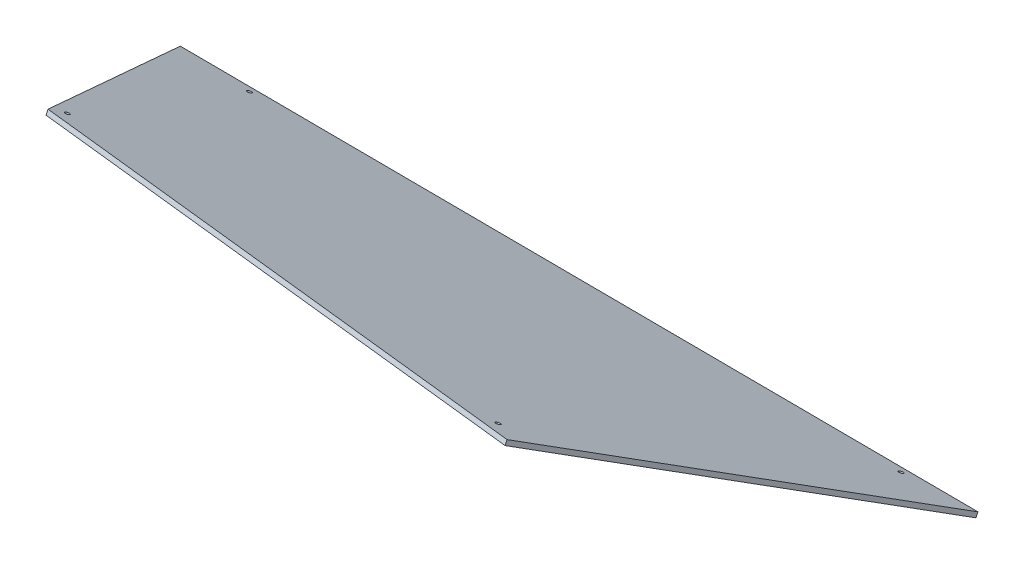
ISO-10303-21;
HEADER;
FILE_DESCRIPTION(('STEP AP214'),'2;1');
FILE_NAME('part.step','',(''),(''),'','','');
FILE_SCHEMA(('AUTOMOTIVE_DESIGN { 1 0 10303 214 1 1 1 1 }'));
ENDSEC;
DATA;
#1=APPLICATION_CONTEXT('core data for automotive mechanical design processes');
#2=APPLICATION_PROTOCOL_DEFINITION('international standard','automotive_design',2000,#1);
#3=PRODUCT_CONTEXT('',#1,'mechanical');
#4=PRODUCT('Part','Part','',(#3));
#5=PRODUCT_RELATED_PRODUCT_CATEGORY('part','',(#4));
#6=PRODUCT_DEFINITION_FORMATION('','',#4);
#7=PRODUCT_DEFINITION_CONTEXT('part definition',#1,'design');
#8=PRODUCT_DEFINITION('design','',#6,#7);
#9=PRODUCT_DEFINITION_SHAPE('','',#8);
#10=(LENGTH_UNIT() NAMED_UNIT(*) SI_UNIT(.MILLI.,.METRE.));
#11=(NAMED_UNIT(*) PLANE_ANGLE_UNIT() SI_UNIT($,.RADIAN.));
#12=(NAMED_UNIT(*) SI_UNIT($,.STERADIAN.) SOLID_ANGLE_UNIT());
#13=UNCERTAINTY_MEASURE_WITH_UNIT(LENGTH_MEASURE(1.E-05),#10,'distance_accuracy_value','');
#14=(GEOMETRIC_REPRESENTATION_CONTEXT(3) GLOBAL_UNCERTAINTY_ASSIGNED_CONTEXT((#13)) GLOBAL_UNIT_ASSIGNED_CONTEXT((#10,
#11,#12)) REPRESENTATION_CONTEXT('',''));
#15=CARTESIAN_POINT('',(0.,0.,0.));
#16=DIRECTION('',(0.,0.,1.));
#17=DIRECTION('',(1.,0.,0.));
#18=AXIS2_PLACEMENT_3D('',#15,#16,#17);
#19=CARTESIAN_POINT('',(-0.00358139259848318,-432.219760344882,1619.03143783743));
#20=DIRECTION('',(0.00422190853313018,0.906095441193539,-0.423052274472818));
#21=DIRECTION('',(0.,0.423056044873322,0.906103516655874));
#22=AXIS2_PLACEMENT_3D('',#19,#20,#21);
#23=PLANE('',#22);
#24=CARTESIAN_POINT('',(-438.261076907726,-528.3911441295,1408.67744413458));
#25=DIRECTION('',(0.00422190853313018,0.906095441193539,-0.423052274472818));
#26=DIRECTION('',(0.,0.423056044873322,0.906103516655874));
#27=AXIS2_PLACEMENT_3D('',#24,#25,#26);
#28=CIRCLE('',#27,3.175);
#29=CARTESIAN_POINT('',(-438.261076907726,-527.047941187028,1411.55432279996));
#30=VERTEX_POINT('',#29);
#31=EDGE_CURVE('E106',#30,#30,#28,.F.);
#32=ORIENTED_EDGE('',*,*,#31,.T.);
#33=EDGE_LOOP('',(#32));
#34=FACE_BOUND('',#33,.T.);
#35=CARTESIAN_POINT('',(309.868495869838,-340.690397496473,1818.16188828813));
#36=DIRECTION('',(0.00422190853313018,0.906095441193539,-0.423052274472818));
#37=DIRECTION('',(0.,0.423056044873322,0.906103516655874));
#38=AXIS2_PLACEMENT_3D('',#35,#36,#37);
#39=CIRCLE('',#38,3.175);
#40=CARTESIAN_POINT('',(309.868495869838,-339.347194554001,1821.03876695351));
#41=VERTEX_POINT('',#40);
#42=EDGE_CURVE('E114',#41,#41,#39,.F.);
#43=ORIENTED_EDGE('',*,*,#42,.T.);
#44=EDGE_LOOP('',(#43));
#45=FACE_BOUND('',#44,.T.);
#46=CARTESIAN_POINT('',(-406.222072695855,-397.7850032731,1688.73005634265));
#47=DIRECTION('',(0.00422190853313018,0.906095441193539,-0.423052274472818));
#48=DIRECTION('',(0.,0.423056044873322,0.906103516655874));
#49=AXIS2_PLACEMENT_3D('',#46,#47,#48);
#50=CIRCLE('',#49,3.175);
#51=CARTESIAN_POINT('',(-406.222072695855,-396.441800330627,1691.60693500803));
#52=VERTEX_POINT('',#51);
#53=EDGE_CURVE('E79',#52,#52,#50,.F.);
#54=ORIENTED_EDGE('',*,*,#53,.T.);
#55=EDGE_LOOP('',(#54));
#56=FACE_BOUND('',#55,.T.);
#57=CARTESIAN_POINT('',(450.723077101153,-531.79197102412,1410.26527637325));
#58=DIRECTION('',(0.00422190853313018,0.906095441193539,-0.423052274472818));
#59=DIRECTION('',(0.,0.423056044873322,0.906103516655874));
#60=AXIS2_PLACEMENT_3D('',#57,#58,#59);
#61=CIRCLE('',#60,3.175);
#62=CARTESIAN_POINT('',(450.723077101153,-530.448768081647,1413.14215503863));
#63=VERTEX_POINT('',#62);
#64=EDGE_CURVE('E76',#63,#63,#61,.F.);
#65=ORIENTED_EDGE('',*,*,#64,.T.);
#66=EDGE_LOOP('',(#65));
#67=FACE_BOUND('',#66,.T.);
#68=DIRECTION('',(0.999991087704454,-0.0038254861688687,0.00178610392584298));
#69=VECTOR('',#68,1.);
#70=CARTESIAN_POINT('',(-0.00358139259848318,-535.440518807558,1397.95270992817));
#71=LINE('',#70,#69);
#72=CARTESIAN_POINT('',(544.180489519039,-537.521831004775,1398.92570523834));
#73=VERTEX_POINT('',#72);
#74=CARTESIAN_POINT('',(-544.203070163425,-533.358672636132,1396.98070442203));
#75=VERTEX_POINT('',#74);
#76=EDGE_CURVE('E57',#73,#75,#71,.F.);
#77=ORIENTED_EDGE('',*,*,#76,.T.);
#78=DIRECTION('',(-0.351213362969676,-0.394761380239891,-0.849006847052853));
#79=VECTOR('',#78,1.);
#80=CARTESIAN_POINT('',(-417.045577507738,-390.434534203116,1704.36531247316));
#81=LINE('',#80,#79);
#82=CARTESIAN_POINT('',(-417.044175234292,-390.432958057503,1704.36870226376));
#83=VERTEX_POINT('',#82);
#84=EDGE_CURVE('E19',#75,#83,#81,.F.);
#85=ORIENTED_EDGE('',*,*,#84,.T.);
#86=DIRECTION('',(-0.981039789113387,-0.0782192678831476,-0.177320834388361));
#87=VECTOR('',#86,1.);
#88=CARTESIAN_POINT('',(346.203234513056,-329.578490923096,1842.32403194868));
#89=LINE('',#88,#87);
#90=CARTESIAN_POINT('',(346.206371306398,-329.578240823475,1842.32459891733));
#91=VERTEX_POINT('',#90);
#92=EDGE_CURVE('E67',#83,#91,#89,.F.);
#93=ORIENTED_EDGE('',*,*,#92,.T.);
#94=DIRECTION('',(-0.374785223744526,0.393653370611545,0.839388503536315));
#95=VECTOR('',#94,1.);
#96=CARTESIAN_POINT('',(544.182552261056,-537.521313271621,1398.92683470707));
#97=LINE('',#96,#95);
#98=EDGE_CURVE('E65',#91,#73,#97,.F.);
#99=ORIENTED_EDGE('',*,*,#98,.T.);
#100=EDGE_LOOP('',(#77,#85,#93,#99));
#101=FACE_BOUND('',#100,.T.);
#102=ADVANCED_FACE('F16',(#34,#45,#56,#67,#101),#23,.T.);
#103=CARTESIAN_POINT('',(-470.450893623128,-456.18531131945,1578.01697448958));
#104=DIRECTION('',(0.936285933441205,-0.152166041281801,-0.316566180633302));
#105=DIRECTION('',(-0.320296045935456,0.,-0.947317498496736));
#106=AXIS2_PLACEMENT_3D('',#103,#104,#105);
#107=PLANE('',#106);
#108=DIRECTION('',(-0.351213362969676,-0.394761380239891,-0.849006847052853));
#109=VECTOR('',#108,1.);
#110=CARTESIAN_POINT('',(-417.069582079928,-396.185087963404,1707.05847399754));
#111=LINE('',#110,#109);
#112=CARTESIAN_POINT('',(-544.2264130891,-539.111904248993,1399.66813711159));
#113=VERTEX_POINT('',#112);
#114=CARTESIAN_POINT('',(-417.070984353477,-396.186664109133,1707.05508420669));
#115=VERTEX_POINT('',#114);
#116=EDGE_CURVE('E95',#113,#115,#111,.F.);
#117=ORIENTED_EDGE('',*,*,#116,.T.);
#118=DIRECTION('',(0.00422190853308475,0.906095441193522,-0.423052274472853));
#119=VECTOR('',#118,1.);
#120=CARTESIAN_POINT('',(-417.070984353477,-396.186664109123,1707.05508420668));
#121=LINE('',#120,#119);
#122=EDGE_CURVE('E70',#115,#83,#121,.T.);
#123=ORIENTED_EDGE('',*,*,#122,.T.);
#124=ORIENTED_EDGE('',*,*,#84,.F.);
#125=DIRECTION('',(-0.00422190853311099,-0.906095441193552,0.42305227447279));
#126=VECTOR('',#125,1.);
#127=CARTESIAN_POINT('',(-544.229879282611,-539.112378687755,1399.66708636496));
#128=LINE('',#127,#126);
#129=EDGE_CURVE('E60',#75,#113,#128,.T.);
#130=ORIENTED_EDGE('',*,*,#129,.T.);
#131=EDGE_LOOP('',(#117,#123,#124,#130));
#132=FACE_BOUND('',#131,.T.);
#133=ADVANCED_FACE('F94',(#132),#107,.F.);
#134=CARTESIAN_POINT('',(-28.1216276110646,-365.175349108852,1777.35684488728));
#135=DIRECTION('',(0.193760438853493,-0.415779746476585,-0.888585445950567));
#136=DIRECTION('',(0.,0.905750436995009,-0.423811450863883));
#137=AXIS2_PLACEMENT_3D('',#134,#135,#136);
#138=PLANE('',#137);
#139=DIRECTION('',(-0.981039789113387,-0.0782192678831475,-0.177320834388361));
#140=VECTOR('',#139,1.);
#141=CARTESIAN_POINT('',(346.182698981222,-335.331696775432,1845.01154782904));
#142=LINE('',#141,#140);
#143=CARTESIAN_POINT('',(346.179562187212,-335.331946875105,1845.01098086026));
#144=VERTEX_POINT('',#143);
#145=EDGE_CURVE('E100',#115,#144,#142,.F.);
#146=ORIENTED_EDGE('',*,*,#145,.T.);
#147=DIRECTION('',(0.0042219085331744,0.906095441193529,-0.423052274472837));
#148=VECTOR('',#147,1.);
#149=CARTESIAN_POINT('',(346.179562187212,-335.331946875128,1845.01098086027));
#150=LINE('',#149,#148);
#151=EDGE_CURVE('E62',#144,#91,#150,.T.);
#152=ORIENTED_EDGE('',*,*,#151,.T.);
#153=ORIENTED_EDGE('',*,*,#92,.F.);
#154=ORIENTED_EDGE('',*,*,#122,.F.);
#155=EDGE_LOOP('',(#146,#152,#153,#154));
#156=FACE_BOUND('',#155,.T.);
#157=ADVANCED_FACE('F99',(#156),#138,.F.);
#158=CARTESIAN_POINT('',(424.551166269604,-417.649082537604,1669.48585526113));
#159=DIRECTION('',(-0.927102050235627,-0.155009919858205,-0.34125315118611));
#160=DIRECTION('',(-0.345428373804897,0.,0.938445117505816));
#161=AXIS2_PLACEMENT_3D('',#158,#159,#160);
#162=PLANE('',#161);
#163=DIRECTION('',(-0.374785223744526,0.393653370611545,0.839388503536316));
#164=VECTOR('',#163,1.);
#165=CARTESIAN_POINT('',(544.157655419997,-543.277027872901,1401.60893381233));
#166=LINE('',#165,#164);
#167=CARTESIAN_POINT('',(544.156699280931,-543.276023598073,1401.61107523117));
#168=VERTEX_POINT('',#167);
#169=EDGE_CURVE('E75',#144,#168,#166,.F.);
#170=ORIENTED_EDGE('',*,*,#169,.T.);
#171=DIRECTION('',(0.00422190853315327,0.906095441193552,-0.42305227447279));
#172=VECTOR('',#171,1.);
#173=CARTESIAN_POINT('',(544.156699280931,-543.276023598096,1401.61107523118));
#174=LINE('',#173,#172);
#175=EDGE_CURVE('E34',#168,#73,#174,.T.);
#176=ORIENTED_EDGE('',*,*,#175,.T.);
#177=ORIENTED_EDGE('',*,*,#98,.F.);
#178=ORIENTED_EDGE('',*,*,#151,.F.);
#179=EDGE_LOOP('',(#170,#176,#177,#178));
#180=FACE_BOUND('',#179,.T.);
#181=ADVANCED_FACE('F73',(#180),#162,.F.);
#182=CARTESIAN_POINT('',(-36.7692399542864,-541.053679646128,1400.57347188301));
#183=DIRECTION('',(0.,0.423056044873294,0.906103516655887));
#184=DIRECTION('',(0.,-0.906103516655887,0.423056044873294));
#185=AXIS2_PLACEMENT_3D('',#182,#183,#184);
#186=PLANE('',#185);
#187=DIRECTION('',(0.999991087704454,-0.0038254861688687,0.00178610392584287));
#188=VECTOR('',#187,1.);
#189=CARTESIAN_POINT('',(-544.223737978874,-539.112402181443,1399.66709733406));
#190=LINE('',#189,#188);
#191=EDGE_CURVE('E104',#168,#113,#190,.F.);
#192=ORIENTED_EDGE('',*,*,#191,.T.);
#193=ORIENTED_EDGE('',*,*,#129,.F.);
#194=ORIENTED_EDGE('',*,*,#76,.F.);
#195=ORIENTED_EDGE('',*,*,#175,.F.);
#196=EDGE_LOOP('',(#192,#193,#194,#195));
#197=FACE_BOUND('',#196,.T.);
#198=ADVANCED_FACE('F59',(#197),#186,.F.);
#199=CARTESIAN_POINT('',(2782.92716822902,500000.012145804,-232285.997336627));
#200=DIRECTION('',(0.00422190853313018,0.906095441193539,-0.423052274472818));
#201=DIRECTION('',(0.,0.423056044873322,0.906103516655874));
#202=AXIS2_PLACEMENT_3D('',#199,#200,#201);
#203=CYLINDRICAL_SURFACE('',#202,3.175);
#204=CARTESIAN_POINT('',(450.696267981967,-537.545677075798,1412.95165831622));
#205=DIRECTION('',(0.00422190853313018,0.906095441193539,-0.423052274472818));
#206=DIRECTION('',(0.,0.423056044873322,0.906103516655874));
#207=AXIS2_PLACEMENT_3D('',#204,#205,#206);
#208=CIRCLE('',#207,3.175);
#209=CARTESIAN_POINT('',(450.696267981967,-536.202474133325,1415.8285369816));
#210=VERTEX_POINT('',#209);
#211=EDGE_CURVE('E156',#210,#210,#208,.F.);
#212=ORIENTED_EDGE('',*,*,#211,.T.);
#213=EDGE_LOOP('',(#212));
#214=FACE_BOUND('',#213,.T.);
#215=ORIENTED_EDGE('',*,*,#64,.F.);
#216=EDGE_LOOP('',(#215));
#217=FACE_BOUND('',#216,.T.);
#218=ADVANCED_FACE('F124',(#214,#217),#203,.F.);
#219=CARTESIAN_POINT('',(1925.35761936063,500000.012147836,-231944.965249655));
#220=DIRECTION('',(0.00422190853313018,0.906095441193539,-0.423052274472818));
#221=DIRECTION('',(0.,0.423056044873322,0.906103516655874));
#222=AXIS2_PLACEMENT_3D('',#219,#220,#221);
#223=CYLINDRICAL_SURFACE('',#222,3.175);
#224=CARTESIAN_POINT('',(-406.248881815043,-403.538709325233,1691.41643828578));
#225=DIRECTION('',(0.00422190853313018,0.906095441193539,-0.423052274472818));
#226=DIRECTION('',(0.,0.423056044873322,0.906103516655874));
#227=AXIS2_PLACEMENT_3D('',#224,#225,#226);
#228=CIRCLE('',#227,3.175);
#229=CARTESIAN_POINT('',(-406.248881815043,-402.19550638276,1694.29331695117));
#230=VERTEX_POINT('',#229);
#231=EDGE_CURVE('E153',#230,#230,#228,.F.);
#232=ORIENTED_EDGE('',*,*,#231,.T.);
#233=EDGE_LOOP('',(#232));
#234=FACE_BOUND('',#233,.T.);
#235=ORIENTED_EDGE('',*,*,#53,.F.);
#236=EDGE_LOOP('',(#235));
#237=FACE_BOUND('',#236,.T.);
#238=ADVANCED_FACE('F121',(#234,#237),#223,.F.);
#239=CARTESIAN_POINT('',(2641.18215833124,500000.012147836,-231788.876178598));
#240=DIRECTION('',(0.00422190853313018,0.906095441193539,-0.423052274472818));
#241=DIRECTION('',(0.,0.423056044873322,0.906103516655874));
#242=AXIS2_PLACEMENT_3D('',#239,#240,#241);
#243=CYLINDRICAL_SURFACE('',#242,3.175);
#244=CARTESIAN_POINT('',(309.841686750654,-346.44410354781,1820.84827023093));
#245=DIRECTION('',(0.00422190853313018,0.906095441193539,-0.423052274472818));
#246=DIRECTION('',(0.,0.423056044873322,0.906103516655874));
#247=AXIS2_PLACEMENT_3D('',#244,#245,#246);
#248=CIRCLE('',#247,3.175);
#249=CARTESIAN_POINT('',(309.841686750654,-345.100900605337,1823.72514889631));
#250=VERTEX_POINT('',#249);
#251=EDGE_CURVE('E25',#250,#250,#248,.F.);
#252=ORIENTED_EDGE('',*,*,#251,.T.);
#253=EDGE_LOOP('',(#252));
#254=FACE_BOUND('',#253,.T.);
#255=ORIENTED_EDGE('',*,*,#42,.F.);
#256=EDGE_LOOP('',(#255));
#257=FACE_BOUND('',#256,.T.);
#258=ADVANCED_FACE('F123',(#254,#257),#243,.F.);
#259=CARTESIAN_POINT('',(1893.92716822927,500000.012145804,-232285.997336627));
#260=DIRECTION('',(0.00422190853313018,0.906095441193539,-0.423052274472818));
#261=DIRECTION('',(0.,0.423056044873322,0.906103516655874));
#262=AXIS2_PLACEMENT_3D('',#259,#260,#261);
#263=CYLINDRICAL_SURFACE('',#262,3.175);
#264=CARTESIAN_POINT('',(-438.287886026912,-534.144850181178,1411.36382607752));
#265=DIRECTION('',(0.00422190853313018,0.906095441193539,-0.423052274472818));
#266=DIRECTION('',(0.,0.423056044873322,0.906103516655874));
#267=AXIS2_PLACEMENT_3D('',#264,#265,#266);
#268=CIRCLE('',#267,3.175);
#269=CARTESIAN_POINT('',(-438.287886026912,-532.801647238706,1414.2407047429));
#270=VERTEX_POINT('',#269);
#271=EDGE_CURVE('E11',#270,#270,#268,.F.);
#272=ORIENTED_EDGE('',*,*,#271,.T.);
#273=EDGE_LOOP('',(#272));
#274=FACE_BOUND('',#273,.T.);
#275=ORIENTED_EDGE('',*,*,#31,.F.);
#276=EDGE_LOOP('',(#275));
#277=FACE_BOUND('',#276,.T.);
#278=ADVANCED_FACE('F132',(#274,#277),#263,.F.);
#279=CARTESIAN_POINT('',(-0.0303905117838536,-437.973466396502,1621.71781978038));
#280=DIRECTION('',(0.00422190853313018,0.906095441193539,-0.423052274472818));
#281=DIRECTION('',(0.,0.423056044873322,0.906103516655874));
#282=AXIS2_PLACEMENT_3D('',#279,#280,#281);
#283=PLANE('',#282);
#284=ORIENTED_EDGE('',*,*,#271,.F.);
#285=EDGE_LOOP('',(#284));
#286=FACE_BOUND('',#285,.T.);
#287=ORIENTED_EDGE('',*,*,#251,.F.);
#288=EDGE_LOOP('',(#287));
#289=FACE_BOUND('',#288,.T.);
#290=ORIENTED_EDGE('',*,*,#231,.F.);
#291=EDGE_LOOP('',(#290));
#292=FACE_BOUND('',#291,.T.);
#293=ORIENTED_EDGE('',*,*,#211,.F.);
#294=EDGE_LOOP('',(#293));
#295=FACE_BOUND('',#294,.T.);
#296=ORIENTED_EDGE('',*,*,#169,.F.);
#297=ORIENTED_EDGE('',*,*,#145,.F.);
#298=ORIENTED_EDGE('',*,*,#116,.F.);
#299=ORIENTED_EDGE('',*,*,#191,.F.);
#300=EDGE_LOOP('',(#296,#297,#298,#299));
#301=FACE_BOUND('',#300,.T.);
#302=ADVANCED_FACE('F102',(#286,#289,#292,#295,#301),#283,.F.);
#303=CLOSED_SHELL('',(#102,#133,#157,#181,#198,#218,#238,#258,#278,#302));
#304=MANIFOLD_SOLID_BREP('B1',#303);
#305=ADVANCED_BREP_SHAPE_REPRESENTATION('',(#18,#304),#14);
#306=SHAPE_DEFINITION_REPRESENTATION(#9,#305);
ENDSEC;
END-ISO-10303-21;
